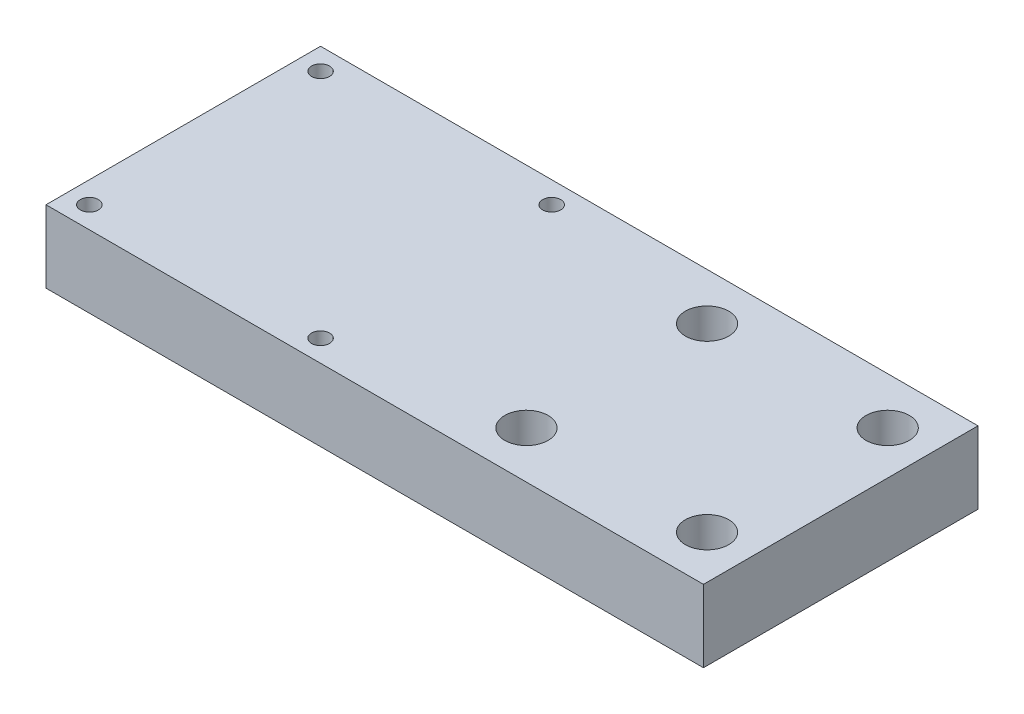
ISO-10303-21;
HEADER;
FILE_DESCRIPTION(('STEP AP214'),'2;1');
FILE_NAME('part.step','',(''),(''),'','','');
FILE_SCHEMA(('AUTOMOTIVE_DESIGN { 1 0 10303 214 1 1 1 1 }'));
ENDSEC;
DATA;
#1=APPLICATION_CONTEXT('core data for automotive mechanical design processes');
#2=APPLICATION_PROTOCOL_DEFINITION('international standard','automotive_design',2000,#1);
#3=PRODUCT_CONTEXT('',#1,'mechanical');
#4=PRODUCT('Part','Part','',(#3));
#5=PRODUCT_RELATED_PRODUCT_CATEGORY('part','',(#4));
#6=PRODUCT_DEFINITION_FORMATION('','',#4);
#7=PRODUCT_DEFINITION_CONTEXT('part definition',#1,'design');
#8=PRODUCT_DEFINITION('design','',#6,#7);
#9=PRODUCT_DEFINITION_SHAPE('','',#8);
#10=(LENGTH_UNIT() NAMED_UNIT(*) SI_UNIT(.MILLI.,.METRE.));
#11=(NAMED_UNIT(*) PLANE_ANGLE_UNIT() SI_UNIT($,.RADIAN.));
#12=(NAMED_UNIT(*) SI_UNIT($,.STERADIAN.) SOLID_ANGLE_UNIT());
#13=UNCERTAINTY_MEASURE_WITH_UNIT(LENGTH_MEASURE(1.E-05),#10,'distance_accuracy_value','');
#14=(GEOMETRIC_REPRESENTATION_CONTEXT(3) GLOBAL_UNCERTAINTY_ASSIGNED_CONTEXT((#13)) GLOBAL_UNIT_ASSIGNED_CONTEXT((#10,
#11,#12)) REPRESENTATION_CONTEXT('',''));
#15=CARTESIAN_POINT('',(0.,0.,0.));
#16=DIRECTION('',(0.,0.,1.));
#17=DIRECTION('',(1.,0.,0.));
#18=AXIS2_PLACEMENT_3D('',#15,#16,#17);
#19=CARTESIAN_POINT('',(0.,10.,0.));
#20=DIRECTION('',(0.,-1.,0.));
#21=DIRECTION('',(0.,0.,-1.));
#22=AXIS2_PLACEMENT_3D('',#19,#20,#21);
#23=PLANE('',#22);
#24=CARTESIAN_POINT('',(16.0304978161497,10.,0.359463258530042));
#25=DIRECTION('',(0.,-1.,0.));
#26=DIRECTION('',(0.,0.,-1.));
#27=AXIS2_PLACEMENT_3D('',#24,#25,#26);
#28=CIRCLE('',#27,1.25);
#29=CARTESIAN_POINT('',(16.0304978161497,10.,-0.890536741469955));
#30=VERTEX_POINT('',#29);
#31=EDGE_CURVE('E157',#30,#30,#28,.T.);
#32=ORIENTED_EDGE('',*,*,#31,.T.);
#33=EDGE_LOOP('',(#32));
#34=FACE_BOUND('',#33,.T.);
#35=CARTESIAN_POINT('',(-15.9695021838503,10.,32.35946325853));
#36=DIRECTION('',(0.,-1.,0.));
#37=DIRECTION('',(0.,0.,-1.));
#38=AXIS2_PLACEMENT_3D('',#35,#36,#37);
#39=CIRCLE('',#38,1.25);
#40=CARTESIAN_POINT('',(-15.9695021838503,10.,31.10946325853));
#41=VERTEX_POINT('',#40);
#42=EDGE_CURVE('E151',#41,#41,#39,.T.);
#43=ORIENTED_EDGE('',*,*,#42,.T.);
#44=EDGE_LOOP('',(#43));
#45=FACE_BOUND('',#44,.T.);
#46=CARTESIAN_POINT('',(16.0304978161497,10.,32.35946325853));
#47=DIRECTION('',(0.,-1.,0.));
#48=DIRECTION('',(0.,0.,-1.));
#49=AXIS2_PLACEMENT_3D('',#46,#47,#48);
#50=CIRCLE('',#49,1.25);
#51=CARTESIAN_POINT('',(16.0304978161497,10.,31.10946325853));
#52=VERTEX_POINT('',#51);
#53=EDGE_CURVE('E145',#52,#52,#50,.T.);
#54=ORIENTED_EDGE('',*,*,#53,.T.);
#55=EDGE_LOOP('',(#54));
#56=FACE_BOUND('',#55,.T.);
#57=CARTESIAN_POINT('',(-15.9695021838503,10.,0.359463258530042));
#58=DIRECTION('',(0.,-1.,0.));
#59=DIRECTION('',(0.,0.,-1.));
#60=AXIS2_PLACEMENT_3D('',#57,#58,#59);
#61=CIRCLE('',#60,1.25);
#62=CARTESIAN_POINT('',(-15.9695021838503,10.,-0.890536741469957));
#63=VERTEX_POINT('',#62);
#64=EDGE_CURVE('E137',#63,#63,#61,.T.);
#65=ORIENTED_EDGE('',*,*,#64,.T.);
#66=EDGE_LOOP('',(#65));
#67=FACE_BOUND('',#66,.T.);
#68=DIRECTION('',(0.,0.,1.));
#69=VECTOR('',#68,1.);
#70=CARTESIAN_POINT('',(-18.9695021838503,10.,35.35946325853));
#71=LINE('',#70,#69);
#72=CARTESIAN_POINT('',(-18.9695021838503,10.,-2.64053674146996));
#73=VERTEX_POINT('',#72);
#74=CARTESIAN_POINT('',(-18.9695021838503,10.,35.35946325853));
#75=VERTEX_POINT('',#74);
#76=EDGE_CURVE('E89',#73,#75,#71,.T.);
#77=ORIENTED_EDGE('',*,*,#76,.T.);
#78=DIRECTION('',(1.,0.,0.));
#79=VECTOR('',#78,1.);
#80=CARTESIAN_POINT('',(-18.9695021838503,10.,35.35946325853));
#81=LINE('',#80,#79);
#82=CARTESIAN_POINT('',(72.0304978161497,10.,35.35946325853));
#83=VERTEX_POINT('',#82);
#84=EDGE_CURVE('E84',#75,#83,#81,.T.);
#85=ORIENTED_EDGE('',*,*,#84,.T.);
#86=DIRECTION('',(0.,0.,-1.));
#87=VECTOR('',#86,1.);
#88=CARTESIAN_POINT('',(72.0304978161497,10.,35.35946325853));
#89=LINE('',#88,#87);
#90=CARTESIAN_POINT('',(72.0304978161497,10.,-2.64053674146996));
#91=VERTEX_POINT('',#90);
#92=EDGE_CURVE('E87',#83,#91,#89,.T.);
#93=ORIENTED_EDGE('',*,*,#92,.T.);
#94=DIRECTION('',(-1.,0.,0.));
#95=VECTOR('',#94,1.);
#96=CARTESIAN_POINT('',(-18.9695021838503,10.,-2.64053674146996));
#97=LINE('',#96,#95);
#98=EDGE_CURVE('E54',#91,#73,#97,.T.);
#99=ORIENTED_EDGE('',*,*,#98,.T.);
#100=EDGE_LOOP('',(#77,#85,#93,#99));
#101=FACE_BOUND('',#100,.T.);
#102=CARTESIAN_POINT('',(41.0304978161497,10.,3.85946325853004));
#103=DIRECTION('',(0.,1.,0.));
#104=DIRECTION('',(0.,0.,1.));
#105=AXIS2_PLACEMENT_3D('',#102,#103,#104);
#106=CIRCLE('',#105,3.00000000000001);
#107=CARTESIAN_POINT('',(41.0304978161497,10.,6.85946325853004));
#108=VERTEX_POINT('',#107);
#109=EDGE_CURVE('E104',#108,#108,#106,.T.);
#110=ORIENTED_EDGE('',*,*,#109,.F.);
#111=EDGE_LOOP('',(#110));
#112=FACE_BOUND('',#111,.T.);
#113=CARTESIAN_POINT('',(66.0304978161497,10.,3.85946325853004));
#114=DIRECTION('',(0.,1.,0.));
#115=DIRECTION('',(0.,0.,1.));
#116=AXIS2_PLACEMENT_3D('',#113,#114,#115);
#117=CIRCLE('',#116,3.00000000000001);
#118=CARTESIAN_POINT('',(66.0304978161497,10.,6.85946325853004));
#119=VERTEX_POINT('',#118);
#120=EDGE_CURVE('E119',#119,#119,#117,.T.);
#121=ORIENTED_EDGE('',*,*,#120,.F.);
#122=EDGE_LOOP('',(#121));
#123=FACE_BOUND('',#122,.T.);
#124=CARTESIAN_POINT('',(66.0304978161497,10.,28.85946325853));
#125=DIRECTION('',(0.,1.,0.));
#126=DIRECTION('',(0.,0.,1.));
#127=AXIS2_PLACEMENT_3D('',#124,#125,#126);
#128=CIRCLE('',#127,3.00000000000001);
#129=CARTESIAN_POINT('',(66.0304978161497,10.,31.85946325853));
#130=VERTEX_POINT('',#129);
#131=EDGE_CURVE('E125',#130,#130,#128,.T.);
#132=ORIENTED_EDGE('',*,*,#131,.F.);
#133=EDGE_LOOP('',(#132));
#134=FACE_BOUND('',#133,.T.);
#135=CARTESIAN_POINT('',(41.0304978161497,10.,28.85946325853));
#136=DIRECTION('',(0.,1.,0.));
#137=DIRECTION('',(0.,0.,1.));
#138=AXIS2_PLACEMENT_3D('',#135,#136,#137);
#139=CIRCLE('',#138,3.00000000000001);
#140=CARTESIAN_POINT('',(41.0304978161497,10.,31.85946325853));
#141=VERTEX_POINT('',#140);
#142=EDGE_CURVE('E131',#141,#141,#139,.T.);
#143=ORIENTED_EDGE('',*,*,#142,.F.);
#144=EDGE_LOOP('',(#143));
#145=FACE_BOUND('',#144,.T.);
#146=ADVANCED_FACE('F37',(#34,#45,#56,#67,#101,#112,#123,#134,#145),#23,.F.);
#147=CARTESIAN_POINT('',(0.,0.,0.));
#148=DIRECTION('',(0.,-1.,0.));
#149=DIRECTION('',(0.,0.,-1.));
#150=AXIS2_PLACEMENT_3D('',#147,#148,#149);
#151=PLANE('',#150);
#152=CARTESIAN_POINT('',(16.0304978161497,0.,0.359463258530042));
#153=DIRECTION('',(0.,-1.,0.));
#154=DIRECTION('',(0.,0.,-1.));
#155=AXIS2_PLACEMENT_3D('',#152,#153,#154);
#156=CIRCLE('',#155,1.25);
#157=CARTESIAN_POINT('',(16.0304978161497,0.,-0.890536741469955));
#158=VERTEX_POINT('',#157);
#159=EDGE_CURVE('E160',#158,#158,#156,.T.);
#160=ORIENTED_EDGE('',*,*,#159,.F.);
#161=EDGE_LOOP('',(#160));
#162=FACE_BOUND('',#161,.T.);
#163=CARTESIAN_POINT('',(-15.9695021838503,0.,32.35946325853));
#164=DIRECTION('',(0.,-1.,0.));
#165=DIRECTION('',(0.,0.,-1.));
#166=AXIS2_PLACEMENT_3D('',#163,#164,#165);
#167=CIRCLE('',#166,1.25);
#168=CARTESIAN_POINT('',(-15.9695021838503,0.,31.10946325853));
#169=VERTEX_POINT('',#168);
#170=EDGE_CURVE('E154',#169,#169,#167,.T.);
#171=ORIENTED_EDGE('',*,*,#170,.F.);
#172=EDGE_LOOP('',(#171));
#173=FACE_BOUND('',#172,.T.);
#174=CARTESIAN_POINT('',(16.0304978161497,0.,32.35946325853));
#175=DIRECTION('',(0.,-1.,0.));
#176=DIRECTION('',(0.,0.,-1.));
#177=AXIS2_PLACEMENT_3D('',#174,#175,#176);
#178=CIRCLE('',#177,1.25);
#179=CARTESIAN_POINT('',(16.0304978161497,0.,31.10946325853));
#180=VERTEX_POINT('',#179);
#181=EDGE_CURVE('E148',#180,#180,#178,.T.);
#182=ORIENTED_EDGE('',*,*,#181,.F.);
#183=EDGE_LOOP('',(#182));
#184=FACE_BOUND('',#183,.T.);
#185=CARTESIAN_POINT('',(-15.9695021838503,0.,0.359463258530042));
#186=DIRECTION('',(0.,-1.,0.));
#187=DIRECTION('',(0.,0.,-1.));
#188=AXIS2_PLACEMENT_3D('',#185,#186,#187);
#189=CIRCLE('',#188,1.25);
#190=CARTESIAN_POINT('',(-15.9695021838503,0.,-0.890536741469957));
#191=VERTEX_POINT('',#190);
#192=EDGE_CURVE('E142',#191,#191,#189,.T.);
#193=ORIENTED_EDGE('',*,*,#192,.F.);
#194=EDGE_LOOP('',(#193));
#195=FACE_BOUND('',#194,.T.);
#196=CARTESIAN_POINT('',(66.0304978161497,0.,28.85946325853));
#197=DIRECTION('',(0.,1.,0.));
#198=DIRECTION('',(0.,0.,1.));
#199=AXIS2_PLACEMENT_3D('',#196,#197,#198);
#200=CIRCLE('',#199,3.00000000000001);
#201=CARTESIAN_POINT('',(66.0304978161497,0.,31.85946325853));
#202=VERTEX_POINT('',#201);
#203=EDGE_CURVE('E128',#202,#202,#200,.T.);
#204=ORIENTED_EDGE('',*,*,#203,.T.);
#205=EDGE_LOOP('',(#204));
#206=FACE_BOUND('',#205,.T.);
#207=CARTESIAN_POINT('',(41.0304978161497,0.,3.85946325853004));
#208=DIRECTION('',(0.,1.,0.));
#209=DIRECTION('',(0.,0.,1.));
#210=AXIS2_PLACEMENT_3D('',#207,#208,#209);
#211=CIRCLE('',#210,3.00000000000001);
#212=CARTESIAN_POINT('',(41.0304978161497,0.,6.85946325853004));
#213=VERTEX_POINT('',#212);
#214=EDGE_CURVE('E116',#213,#213,#211,.T.);
#215=ORIENTED_EDGE('',*,*,#214,.T.);
#216=EDGE_LOOP('',(#215));
#217=FACE_BOUND('',#216,.T.);
#218=DIRECTION('',(0.,0.,1.));
#219=VECTOR('',#218,1.);
#220=CARTESIAN_POINT('',(-18.9695021838503,0.,35.35946325853));
#221=LINE('',#220,#219);
#222=CARTESIAN_POINT('',(-18.9695021838503,0.,-2.64053674146996));
#223=VERTEX_POINT('',#222);
#224=CARTESIAN_POINT('',(-18.9695021838503,0.,35.35946325853));
#225=VERTEX_POINT('',#224);
#226=EDGE_CURVE('E101',#223,#225,#221,.T.);
#227=ORIENTED_EDGE('',*,*,#226,.F.);
#228=DIRECTION('',(-1.,0.,0.));
#229=VECTOR('',#228,1.);
#230=CARTESIAN_POINT('',(-18.9695021838503,0.,-2.64053674146996));
#231=LINE('',#230,#229);
#232=CARTESIAN_POINT('',(72.0304978161497,0.,-2.64053674146996));
#233=VERTEX_POINT('',#232);
#234=EDGE_CURVE('E77',#233,#223,#231,.T.);
#235=ORIENTED_EDGE('',*,*,#234,.F.);
#236=DIRECTION('',(0.,0.,-1.));
#237=VECTOR('',#236,1.);
#238=CARTESIAN_POINT('',(72.0304978161497,0.,35.35946325853));
#239=LINE('',#238,#237);
#240=CARTESIAN_POINT('',(72.0304978161497,0.,35.35946325853));
#241=VERTEX_POINT('',#240);
#242=EDGE_CURVE('E71',#241,#233,#239,.T.);
#243=ORIENTED_EDGE('',*,*,#242,.F.);
#244=DIRECTION('',(1.,0.,0.));
#245=VECTOR('',#244,1.);
#246=CARTESIAN_POINT('',(-18.9695021838503,0.,35.35946325853));
#247=LINE('',#246,#245);
#248=EDGE_CURVE('E93',#225,#241,#247,.T.);
#249=ORIENTED_EDGE('',*,*,#248,.F.);
#250=EDGE_LOOP('',(#227,#235,#243,#249));
#251=FACE_BOUND('',#250,.T.);
#252=CARTESIAN_POINT('',(66.0304978161497,0.,3.85946325853004));
#253=DIRECTION('',(0.,1.,0.));
#254=DIRECTION('',(0.,0.,1.));
#255=AXIS2_PLACEMENT_3D('',#252,#253,#254);
#256=CIRCLE('',#255,3.00000000000001);
#257=CARTESIAN_POINT('',(66.0304978161497,0.,6.85946325853004));
#258=VERTEX_POINT('',#257);
#259=EDGE_CURVE('E122',#258,#258,#256,.T.);
#260=ORIENTED_EDGE('',*,*,#259,.T.);
#261=EDGE_LOOP('',(#260));
#262=FACE_BOUND('',#261,.T.);
#263=CARTESIAN_POINT('',(41.0304978161497,0.,28.85946325853));
#264=DIRECTION('',(0.,1.,0.));
#265=DIRECTION('',(0.,0.,1.));
#266=AXIS2_PLACEMENT_3D('',#263,#264,#265);
#267=CIRCLE('',#266,3.00000000000001);
#268=CARTESIAN_POINT('',(41.0304978161497,0.,31.85946325853));
#269=VERTEX_POINT('',#268);
#270=EDGE_CURVE('E134',#269,#269,#267,.T.);
#271=ORIENTED_EDGE('',*,*,#270,.T.);
#272=EDGE_LOOP('',(#271));
#273=FACE_BOUND('',#272,.T.);
#274=ADVANCED_FACE('F112',(#162,#173,#184,#195,#206,#217,#251,#262,#273),#151,.T.);
#275=CARTESIAN_POINT('',(-18.9695021838503,10.,35.35946325853));
#276=DIRECTION('',(1.,0.,0.));
#277=DIRECTION('',(0.,0.,-1.));
#278=AXIS2_PLACEMENT_3D('',#275,#276,#277);
#279=PLANE('',#278);
#280=ORIENTED_EDGE('',*,*,#226,.T.);
#281=DIRECTION('',(0.,-1.,0.));
#282=VECTOR('',#281,1.);
#283=CARTESIAN_POINT('',(-18.9695021838503,10.,35.35946325853));
#284=LINE('',#283,#282);
#285=EDGE_CURVE('E11',#75,#225,#284,.T.);
#286=ORIENTED_EDGE('',*,*,#285,.F.);
#287=ORIENTED_EDGE('',*,*,#76,.F.);
#288=DIRECTION('',(0.,-1.,0.));
#289=VECTOR('',#288,1.);
#290=CARTESIAN_POINT('',(-18.9695021838503,10.,-2.64053674146996));
#291=LINE('',#290,#289);
#292=EDGE_CURVE('E97',#73,#223,#291,.T.);
#293=ORIENTED_EDGE('',*,*,#292,.T.);
#294=EDGE_LOOP('',(#280,#286,#287,#293));
#295=FACE_BOUND('',#294,.T.);
#296=ADVANCED_FACE('F39',(#295),#279,.F.);
#297=CARTESIAN_POINT('',(-18.9695021838503,10.,35.35946325853));
#298=DIRECTION('',(0.,0.,-1.));
#299=DIRECTION('',(-1.,0.,0.));
#300=AXIS2_PLACEMENT_3D('',#297,#298,#299);
#301=PLANE('',#300);
#302=ORIENTED_EDGE('',*,*,#248,.T.);
#303=DIRECTION('',(0.,-1.,0.));
#304=VECTOR('',#303,1.);
#305=CARTESIAN_POINT('',(72.0304978161497,10.,35.35946325853));
#306=LINE('',#305,#304);
#307=EDGE_CURVE('E46',#83,#241,#306,.T.);
#308=ORIENTED_EDGE('',*,*,#307,.F.);
#309=ORIENTED_EDGE('',*,*,#84,.F.);
#310=ORIENTED_EDGE('',*,*,#285,.T.);
#311=EDGE_LOOP('',(#302,#308,#309,#310));
#312=FACE_BOUND('',#311,.T.);
#313=ADVANCED_FACE('F92',(#312),#301,.F.);
#314=CARTESIAN_POINT('',(72.0304978161497,10.,35.35946325853));
#315=DIRECTION('',(-1.,0.,0.));
#316=DIRECTION('',(0.,0.,1.));
#317=AXIS2_PLACEMENT_3D('',#314,#315,#316);
#318=PLANE('',#317);
#319=ORIENTED_EDGE('',*,*,#242,.T.);
#320=DIRECTION('',(0.,-1.,0.));
#321=VECTOR('',#320,1.);
#322=CARTESIAN_POINT('',(72.0304978161497,10.,-2.64053674146996));
#323=LINE('',#322,#321);
#324=EDGE_CURVE('E94',#91,#233,#323,.T.);
#325=ORIENTED_EDGE('',*,*,#324,.F.);
#326=ORIENTED_EDGE('',*,*,#92,.F.);
#327=ORIENTED_EDGE('',*,*,#307,.T.);
#328=EDGE_LOOP('',(#319,#325,#326,#327));
#329=FACE_BOUND('',#328,.T.);
#330=ADVANCED_FACE('F95',(#329),#318,.F.);
#331=CARTESIAN_POINT('',(-18.9695021838503,10.,-2.64053674146996));
#332=DIRECTION('',(0.,0.,1.));
#333=DIRECTION('',(1.,0.,0.));
#334=AXIS2_PLACEMENT_3D('',#331,#332,#333);
#335=PLANE('',#334);
#336=ORIENTED_EDGE('',*,*,#234,.T.);
#337=ORIENTED_EDGE('',*,*,#292,.F.);
#338=ORIENTED_EDGE('',*,*,#98,.F.);
#339=ORIENTED_EDGE('',*,*,#324,.T.);
#340=EDGE_LOOP('',(#336,#337,#338,#339));
#341=FACE_BOUND('',#340,.T.);
#342=ADVANCED_FACE('F109',(#341),#335,.F.);
#343=CARTESIAN_POINT('',(41.0304978161497,10.,3.85946325853004));
#344=DIRECTION('',(0.,-1.,0.));
#345=DIRECTION('',(0.,0.,-1.));
#346=AXIS2_PLACEMENT_3D('',#343,#344,#345);
#347=CYLINDRICAL_SURFACE('',#346,3.00000000000001);
#348=ORIENTED_EDGE('',*,*,#109,.T.);
#349=EDGE_LOOP('',(#348));
#350=FACE_BOUND('',#349,.T.);
#351=ORIENTED_EDGE('',*,*,#214,.F.);
#352=EDGE_LOOP('',(#351));
#353=FACE_BOUND('',#352,.T.);
#354=ADVANCED_FACE('F179',(#350,#353),#347,.F.);
#355=CARTESIAN_POINT('',(66.0304978161497,10.,3.85946325853004));
#356=DIRECTION('',(0.,-1.,0.));
#357=DIRECTION('',(0.,0.,-1.));
#358=AXIS2_PLACEMENT_3D('',#355,#356,#357);
#359=CYLINDRICAL_SURFACE('',#358,3.00000000000001);
#360=ORIENTED_EDGE('',*,*,#120,.T.);
#361=EDGE_LOOP('',(#360));
#362=FACE_BOUND('',#361,.T.);
#363=ORIENTED_EDGE('',*,*,#259,.F.);
#364=EDGE_LOOP('',(#363));
#365=FACE_BOUND('',#364,.T.);
#366=ADVANCED_FACE('F181',(#362,#365),#359,.F.);
#367=CARTESIAN_POINT('',(66.0304978161497,10.,28.85946325853));
#368=DIRECTION('',(0.,-1.,0.));
#369=DIRECTION('',(0.,0.,-1.));
#370=AXIS2_PLACEMENT_3D('',#367,#368,#369);
#371=CYLINDRICAL_SURFACE('',#370,3.00000000000001);
#372=ORIENTED_EDGE('',*,*,#131,.T.);
#373=EDGE_LOOP('',(#372));
#374=FACE_BOUND('',#373,.T.);
#375=ORIENTED_EDGE('',*,*,#203,.F.);
#376=EDGE_LOOP('',(#375));
#377=FACE_BOUND('',#376,.T.);
#378=ADVANCED_FACE('F188',(#374,#377),#371,.F.);
#379=CARTESIAN_POINT('',(41.0304978161497,10.,28.85946325853));
#380=DIRECTION('',(0.,-1.,0.));
#381=DIRECTION('',(0.,0.,-1.));
#382=AXIS2_PLACEMENT_3D('',#379,#380,#381);
#383=CYLINDRICAL_SURFACE('',#382,3.00000000000001);
#384=ORIENTED_EDGE('',*,*,#142,.T.);
#385=EDGE_LOOP('',(#384));
#386=FACE_BOUND('',#385,.T.);
#387=ORIENTED_EDGE('',*,*,#270,.F.);
#388=EDGE_LOOP('',(#387));
#389=FACE_BOUND('',#388,.T.);
#390=ADVANCED_FACE('F245',(#386,#389),#383,.F.);
#391=CARTESIAN_POINT('',(-15.9695021838503,0.,0.359463258530042));
#392=DIRECTION('',(0.,-1.,0.));
#393=DIRECTION('',(0.,0.,-1.));
#394=AXIS2_PLACEMENT_3D('',#391,#392,#393);
#395=CYLINDRICAL_SURFACE('',#394,1.25);
#396=ORIENTED_EDGE('',*,*,#64,.F.);
#397=EDGE_LOOP('',(#396));
#398=FACE_BOUND('',#397,.T.);
#399=ORIENTED_EDGE('',*,*,#192,.T.);
#400=EDGE_LOOP('',(#399));
#401=FACE_BOUND('',#400,.T.);
#402=ADVANCED_FACE('F236',(#398,#401),#395,.F.);
#403=CARTESIAN_POINT('',(16.0304978161497,0.,32.35946325853));
#404=DIRECTION('',(0.,-1.,0.));
#405=DIRECTION('',(0.,0.,-1.));
#406=AXIS2_PLACEMENT_3D('',#403,#404,#405);
#407=CYLINDRICAL_SURFACE('',#406,1.25);
#408=ORIENTED_EDGE('',*,*,#53,.F.);
#409=EDGE_LOOP('',(#408));
#410=FACE_BOUND('',#409,.T.);
#411=ORIENTED_EDGE('',*,*,#181,.T.);
#412=EDGE_LOOP('',(#411));
#413=FACE_BOUND('',#412,.T.);
#414=ADVANCED_FACE('F229',(#410,#413),#407,.F.);
#415=CARTESIAN_POINT('',(-15.9695021838503,0.,32.35946325853));
#416=DIRECTION('',(0.,-1.,0.));
#417=DIRECTION('',(0.,0.,-1.));
#418=AXIS2_PLACEMENT_3D('',#415,#416,#417);
#419=CYLINDRICAL_SURFACE('',#418,1.25);
#420=ORIENTED_EDGE('',*,*,#42,.F.);
#421=EDGE_LOOP('',(#420));
#422=FACE_BOUND('',#421,.T.);
#423=ORIENTED_EDGE('',*,*,#170,.T.);
#424=EDGE_LOOP('',(#423));
#425=FACE_BOUND('',#424,.T.);
#426=ADVANCED_FACE('F219',(#422,#425),#419,.F.);
#427=CARTESIAN_POINT('',(16.0304978161497,0.,0.359463258530042));
#428=DIRECTION('',(0.,-1.,0.));
#429=DIRECTION('',(0.,0.,-1.));
#430=AXIS2_PLACEMENT_3D('',#427,#428,#429);
#431=CYLINDRICAL_SURFACE('',#430,1.25);
#432=ORIENTED_EDGE('',*,*,#31,.F.);
#433=EDGE_LOOP('',(#432));
#434=FACE_BOUND('',#433,.T.);
#435=ORIENTED_EDGE('',*,*,#159,.T.);
#436=EDGE_LOOP('',(#435));
#437=FACE_BOUND('',#436,.T.);
#438=ADVANCED_FACE('F164',(#434,#437),#431,.F.);
#439=CLOSED_SHELL('',(#146,#274,#296,#313,#330,#342,#354,#366,#378,#390,#402,#414,#426,#438));
#440=MANIFOLD_SOLID_BREP('B2',#439);
#441=ADVANCED_BREP_SHAPE_REPRESENTATION('',(#18,#440),#14);
#442=SHAPE_DEFINITION_REPRESENTATION(#9,#441);
ENDSEC;
END-ISO-10303-21;
